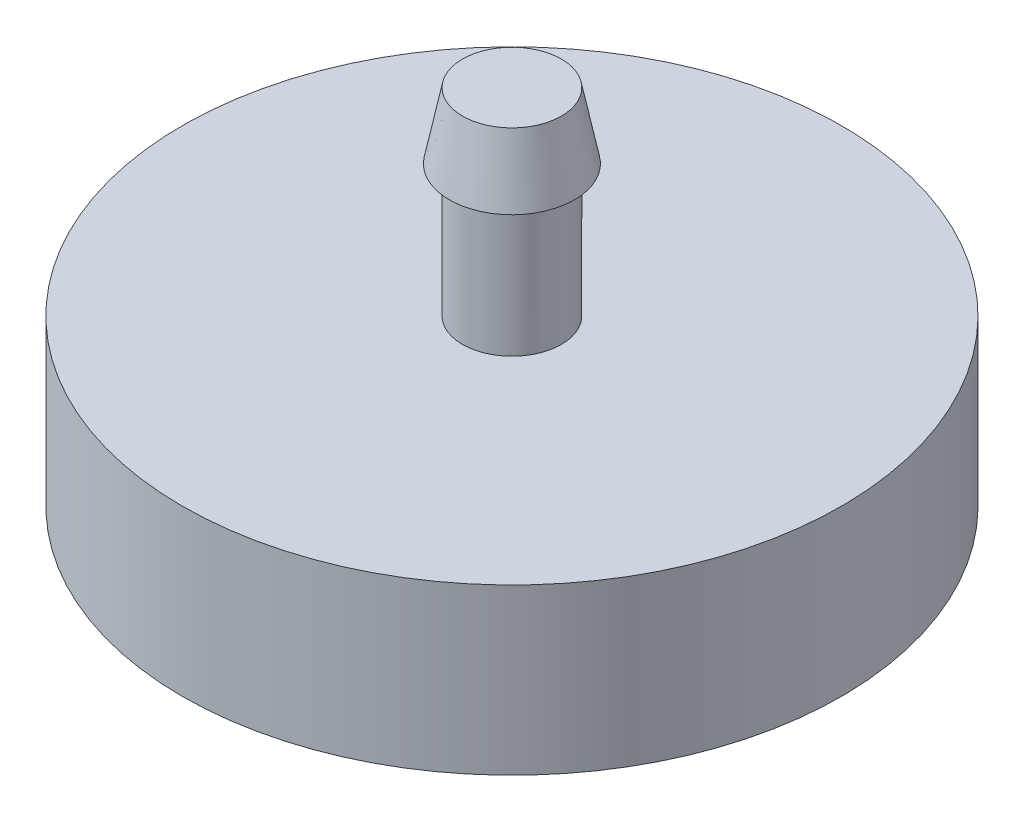
ISO-10303-21;
HEADER;
FILE_DESCRIPTION(('STEP AP214'),'2;1');
FILE_NAME('part.step','',(''),(''),'','','');
FILE_SCHEMA(('AUTOMOTIVE_DESIGN { 1 0 10303 214 1 1 1 1 }'));
ENDSEC;
DATA;
#1=APPLICATION_CONTEXT('core data for automotive mechanical design processes');
#2=APPLICATION_PROTOCOL_DEFINITION('international standard','automotive_design',2000,#1);
#3=PRODUCT_CONTEXT('',#1,'mechanical');
#4=PRODUCT('Part','Part','',(#3));
#5=PRODUCT_RELATED_PRODUCT_CATEGORY('part','',(#4));
#6=PRODUCT_DEFINITION_FORMATION('','',#4);
#7=PRODUCT_DEFINITION_CONTEXT('part definition',#1,'design');
#8=PRODUCT_DEFINITION('design','',#6,#7);
#9=PRODUCT_DEFINITION_SHAPE('','',#8);
#10=(LENGTH_UNIT() NAMED_UNIT(*) SI_UNIT(.MILLI.,.METRE.));
#11=(NAMED_UNIT(*) PLANE_ANGLE_UNIT() SI_UNIT($,.RADIAN.));
#12=(NAMED_UNIT(*) SI_UNIT($,.STERADIAN.) SOLID_ANGLE_UNIT());
#13=UNCERTAINTY_MEASURE_WITH_UNIT(LENGTH_MEASURE(1.E-05),#10,'distance_accuracy_value','');
#14=(GEOMETRIC_REPRESENTATION_CONTEXT(3) GLOBAL_UNCERTAINTY_ASSIGNED_CONTEXT((#13)) GLOBAL_UNIT_ASSIGNED_CONTEXT((#10,
#11,#12)) REPRESENTATION_CONTEXT('',''));
#15=CARTESIAN_POINT('',(0.,0.,0.));
#16=DIRECTION('',(0.,0.,1.));
#17=DIRECTION('',(1.,0.,0.));
#18=AXIS2_PLACEMENT_3D('',#15,#16,#17);
#19=CARTESIAN_POINT('',(0.,2.5,0.));
#20=DIRECTION('',(0.,-1.,0.));
#21=DIRECTION('',(0.,0.,-1.));
#22=AXIS2_PLACEMENT_3D('',#19,#20,#21);
#23=CYLINDRICAL_SURFACE('',#22,5.);
#24=CARTESIAN_POINT('',(0.,2.5,0.));
#25=DIRECTION('',(0.,1.,0.));
#26=DIRECTION('',(0.,0.,1.));
#27=AXIS2_PLACEMENT_3D('',#24,#25,#26);
#28=CIRCLE('',#27,5.);
#29=CARTESIAN_POINT('',(0.,2.5,5.));
#30=VERTEX_POINT('',#29);
#31=EDGE_CURVE('E38',#30,#30,#28,.T.);
#32=ORIENTED_EDGE('',*,*,#31,.F.);
#33=EDGE_LOOP('',(#32));
#34=FACE_BOUND('',#33,.T.);
#35=CARTESIAN_POINT('',(0.,0.,0.));
#36=DIRECTION('',(0.,1.,0.));
#37=DIRECTION('',(0.,0.,1.));
#38=AXIS2_PLACEMENT_3D('',#35,#36,#37);
#39=CIRCLE('',#38,5.);
#40=CARTESIAN_POINT('',(0.,0.,5.));
#41=VERTEX_POINT('',#40);
#42=EDGE_CURVE('E34',#41,#41,#39,.T.);
#43=ORIENTED_EDGE('',*,*,#42,.T.);
#44=EDGE_LOOP('',(#43));
#45=FACE_BOUND('',#44,.T.);
#46=ADVANCED_FACE('F31',(#34,#45),#23,.T.);
#47=CARTESIAN_POINT('',(0.,2.5,0.));
#48=DIRECTION('',(0.,1.,0.));
#49=DIRECTION('',(0.,0.,1.));
#50=AXIS2_PLACEMENT_3D('',#47,#48,#49);
#51=PLANE('',#50);
#52=CARTESIAN_POINT('',(0.,2.5,0.));
#53=DIRECTION('',(0.,1.,0.));
#54=DIRECTION('',(0.,0.,1.));
#55=AXIS2_PLACEMENT_3D('',#52,#53,#54);
#56=CIRCLE('',#55,0.75);
#57=CARTESIAN_POINT('',(0.,2.5,0.75));
#58=VERTEX_POINT('',#57);
#59=EDGE_CURVE('E10',#58,#58,#56,.T.);
#60=ORIENTED_EDGE('',*,*,#59,.F.);
#61=EDGE_LOOP('',(#60));
#62=FACE_BOUND('',#61,.T.);
#63=ORIENTED_EDGE('',*,*,#31,.T.);
#64=EDGE_LOOP('',(#63));
#65=FACE_BOUND('',#64,.T.);
#66=ADVANCED_FACE('F69',(#62,#65),#51,.T.);
#67=CARTESIAN_POINT('',(0.,0.,0.));
#68=DIRECTION('',(0.,1.,0.));
#69=DIRECTION('',(0.,0.,1.));
#70=AXIS2_PLACEMENT_3D('',#67,#68,#69);
#71=PLANE('',#70);
#72=ORIENTED_EDGE('',*,*,#42,.F.);
#73=EDGE_LOOP('',(#72));
#74=FACE_BOUND('',#73,.T.);
#75=ADVANCED_FACE('F74',(#74),#71,.F.);
#76=CARTESIAN_POINT('',(0.,5.5,0.));
#77=DIRECTION('',(0.,-1.,0.));
#78=DIRECTION('',(0.,0.,-1.));
#79=AXIS2_PLACEMENT_3D('',#76,#77,#78);
#80=CYLINDRICAL_SURFACE('',#79,0.75);
#81=CARTESIAN_POINT('',(0.,4.5,0.));
#82=DIRECTION('',(0.,-1.,0.));
#83=DIRECTION('',(0.,0.,-1.));
#84=AXIS2_PLACEMENT_3D('',#81,#82,#83);
#85=CIRCLE('',#84,0.75);
#86=CARTESIAN_POINT('',(0.,4.5,-0.75));
#87=VERTEX_POINT('',#86);
#88=EDGE_CURVE('E47',#87,#87,#85,.T.);
#89=ORIENTED_EDGE('',*,*,#88,.T.);
#90=EDGE_LOOP('',(#89));
#91=FACE_BOUND('',#90,.T.);
#92=ORIENTED_EDGE('',*,*,#59,.T.);
#93=EDGE_LOOP('',(#92));
#94=FACE_BOUND('',#93,.T.);
#95=ADVANCED_FACE('F83',(#91,#94),#80,.T.);
#96=CARTESIAN_POINT('',(0.,4.5,0.));
#97=DIRECTION('',(0.,-1.,0.));
#98=DIRECTION('',(0.,0.,-1.));
#99=AXIS2_PLACEMENT_3D('',#96,#97,#98);
#100=CONICAL_SURFACE('',#99,0.95,0.197395559849881);
#101=CARTESIAN_POINT('',(0.,5.5,0.));
#102=DIRECTION('',(0.,-1.,0.));
#103=DIRECTION('',(0.,0.,-1.));
#104=AXIS2_PLACEMENT_3D('',#101,#102,#103);
#105=CIRCLE('',#104,0.75);
#106=CARTESIAN_POINT('',(0.,5.5,-0.75));
#107=VERTEX_POINT('',#106);
#108=EDGE_CURVE('E50',#107,#107,#105,.T.);
#109=ORIENTED_EDGE('',*,*,#108,.T.);
#110=EDGE_LOOP('',(#109));
#111=FACE_BOUND('',#110,.T.);
#112=CARTESIAN_POINT('',(0.,4.5,0.));
#113=DIRECTION('',(0.,-1.,0.));
#114=DIRECTION('',(0.,0.,-1.));
#115=AXIS2_PLACEMENT_3D('',#112,#113,#114);
#116=CIRCLE('',#115,0.95);
#117=CARTESIAN_POINT('',(0.,4.5,-0.95));
#118=VERTEX_POINT('',#117);
#119=EDGE_CURVE('E44',#118,#118,#116,.T.);
#120=ORIENTED_EDGE('',*,*,#119,.F.);
#121=EDGE_LOOP('',(#120));
#122=FACE_BOUND('',#121,.T.);
#123=ADVANCED_FACE('F54',(#111,#122),#100,.T.);
#124=CARTESIAN_POINT('',(0.75,4.5,0.));
#125=DIRECTION('',(0.,-1.,0.));
#126=DIRECTION('',(0.,0.,-1.));
#127=AXIS2_PLACEMENT_3D('',#124,#125,#126);
#128=PLANE('',#127);
#129=ORIENTED_EDGE('',*,*,#119,.T.);
#130=EDGE_LOOP('',(#129));
#131=FACE_BOUND('',#130,.T.);
#132=ORIENTED_EDGE('',*,*,#88,.F.);
#133=EDGE_LOOP('',(#132));
#134=FACE_BOUND('',#133,.T.);
#135=ADVANCED_FACE('F59',(#131,#134),#128,.T.);
#136=CARTESIAN_POINT('',(0.,5.5,0.));
#137=DIRECTION('',(0.,1.,0.));
#138=DIRECTION('',(0.,0.,1.));
#139=AXIS2_PLACEMENT_3D('',#136,#137,#138);
#140=PLANE('',#139);
#141=ORIENTED_EDGE('',*,*,#108,.F.);
#142=EDGE_LOOP('',(#141));
#143=FACE_BOUND('',#142,.T.);
#144=ADVANCED_FACE('F57',(#143),#140,.T.);
#145=CLOSED_SHELL('',(#46,#66,#75,#95,#123,#135,#144));
#146=MANIFOLD_SOLID_BREP('B2',#145);
#147=ADVANCED_BREP_SHAPE_REPRESENTATION('',(#18,#146),#14);
#148=SHAPE_DEFINITION_REPRESENTATION(#9,#147);
ENDSEC;
END-ISO-10303-21;
